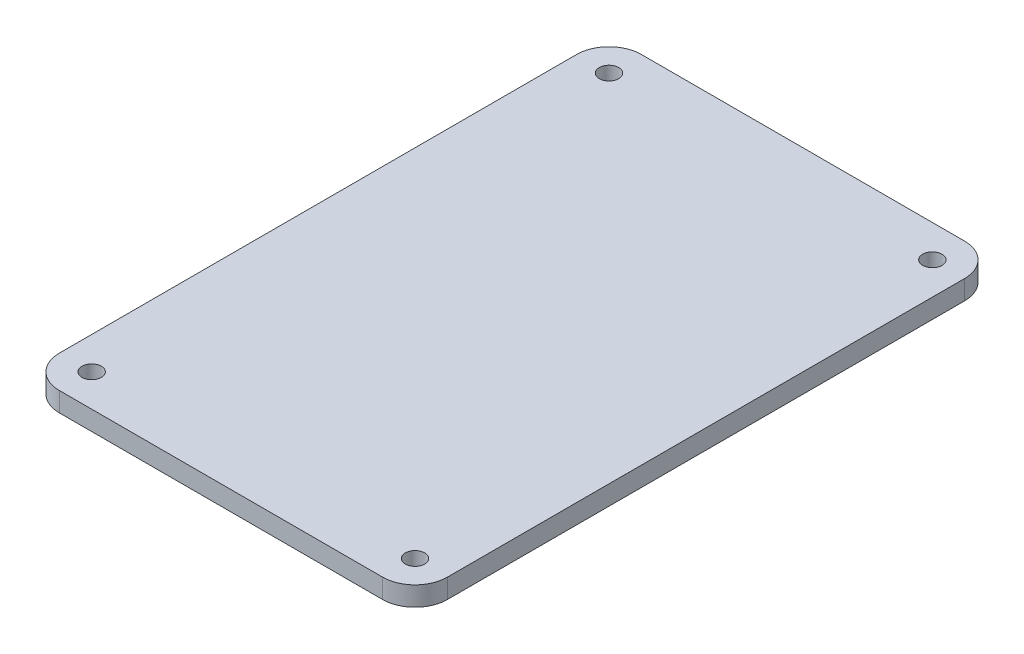
ISO-10303-21;
HEADER;
FILE_DESCRIPTION(('STEP AP214'),'2;1');
FILE_NAME('part.step','',(''),(''),'','','');
FILE_SCHEMA(('AUTOMOTIVE_DESIGN { 1 0 10303 214 1 1 1 1 }'));
ENDSEC;
DATA;
#1=APPLICATION_CONTEXT('core data for automotive mechanical design processes');
#2=APPLICATION_PROTOCOL_DEFINITION('international standard','automotive_design',2000,#1);
#3=PRODUCT_CONTEXT('',#1,'mechanical');
#4=PRODUCT('Part','Part','',(#3));
#5=PRODUCT_RELATED_PRODUCT_CATEGORY('part','',(#4));
#6=PRODUCT_DEFINITION_FORMATION('','',#4);
#7=PRODUCT_DEFINITION_CONTEXT('part definition',#1,'design');
#8=PRODUCT_DEFINITION('design','',#6,#7);
#9=PRODUCT_DEFINITION_SHAPE('','',#8);
#10=(LENGTH_UNIT() NAMED_UNIT(*) SI_UNIT(.MILLI.,.METRE.));
#11=(NAMED_UNIT(*) PLANE_ANGLE_UNIT() SI_UNIT($,.RADIAN.));
#12=(NAMED_UNIT(*) SI_UNIT($,.STERADIAN.) SOLID_ANGLE_UNIT());
#13=UNCERTAINTY_MEASURE_WITH_UNIT(LENGTH_MEASURE(1.E-05),#10,'distance_accuracy_value','');
#14=(GEOMETRIC_REPRESENTATION_CONTEXT(3) GLOBAL_UNCERTAINTY_ASSIGNED_CONTEXT((#13)) GLOBAL_UNIT_ASSIGNED_CONTEXT((#10,
#11,#12)) REPRESENTATION_CONTEXT('',''));
#15=CARTESIAN_POINT('',(0.,0.,0.));
#16=DIRECTION('',(0.,0.,1.));
#17=DIRECTION('',(1.,0.,0.));
#18=AXIS2_PLACEMENT_3D('',#15,#16,#17);
#19=CARTESIAN_POINT('',(25.,3.,40.));
#20=DIRECTION('',(0.,1.,0.));
#21=DIRECTION('',(0.,0.,1.));
#22=AXIS2_PLACEMENT_3D('',#19,#20,#21);
#23=PLANE('',#22);
#24=CARTESIAN_POINT('',(-25.,3.,40.));
#25=DIRECTION('',(0.,1.,0.));
#26=DIRECTION('',(0.,0.,1.));
#27=AXIS2_PLACEMENT_3D('',#24,#25,#26);
#28=CIRCLE('',#27,1.5);
#29=CARTESIAN_POINT('',(-25.,3.,41.5));
#30=VERTEX_POINT('',#29);
#31=EDGE_CURVE('E188',#30,#30,#28,.T.);
#32=ORIENTED_EDGE('',*,*,#31,.F.);
#33=EDGE_LOOP('',(#32));
#34=FACE_BOUND('',#33,.T.);
#35=CARTESIAN_POINT('',(-25.,3.,-40.));
#36=DIRECTION('',(0.,1.,0.));
#37=DIRECTION('',(0.,0.,1.));
#38=AXIS2_PLACEMENT_3D('',#35,#36,#37);
#39=CIRCLE('',#38,1.5);
#40=CARTESIAN_POINT('',(-25.,3.,-38.5));
#41=VERTEX_POINT('',#40);
#42=EDGE_CURVE('E134',#41,#41,#39,.T.);
#43=ORIENTED_EDGE('',*,*,#42,.F.);
#44=EDGE_LOOP('',(#43));
#45=FACE_BOUND('',#44,.T.);
#46=CARTESIAN_POINT('',(25.,3.,40.));
#47=DIRECTION('',(0.,1.,0.));
#48=DIRECTION('',(0.,0.,1.));
#49=AXIS2_PLACEMENT_3D('',#46,#47,#48);
#50=CIRCLE('',#49,5.);
#51=CARTESIAN_POINT('',(25.,3.,45.));
#52=VERTEX_POINT('',#51);
#53=CARTESIAN_POINT('',(30.,3.,40.));
#54=VERTEX_POINT('',#53);
#55=EDGE_CURVE('E145',#52,#54,#50,.T.);
#56=ORIENTED_EDGE('',*,*,#55,.T.);
#57=DIRECTION('',(0.,0.,-1.));
#58=VECTOR('',#57,1.);
#59=CARTESIAN_POINT('',(30.,3.,40.));
#60=LINE('',#59,#58);
#61=CARTESIAN_POINT('',(30.,3.,-40.));
#62=VERTEX_POINT('',#61);
#63=EDGE_CURVE('E93',#54,#62,#60,.T.);
#64=ORIENTED_EDGE('',*,*,#63,.T.);
#65=CARTESIAN_POINT('',(25.,3.,-40.));
#66=DIRECTION('',(0.,1.,0.));
#67=DIRECTION('',(0.,0.,-1.));
#68=AXIS2_PLACEMENT_3D('',#65,#66,#67);
#69=CIRCLE('',#68,5.);
#70=CARTESIAN_POINT('',(25.,3.,-45.));
#71=VERTEX_POINT('',#70);
#72=EDGE_CURVE('E160',#62,#71,#69,.T.);
#73=ORIENTED_EDGE('',*,*,#72,.T.);
#74=DIRECTION('',(-1.,0.,0.));
#75=VECTOR('',#74,1.);
#76=CARTESIAN_POINT('',(-25.,3.,-45.));
#77=LINE('',#76,#75);
#78=CARTESIAN_POINT('',(-25.,3.,-45.));
#79=VERTEX_POINT('',#78);
#80=EDGE_CURVE('E173',#71,#79,#77,.T.);
#81=ORIENTED_EDGE('',*,*,#80,.T.);
#82=CARTESIAN_POINT('',(-25.,3.,-40.));
#83=DIRECTION('',(0.,1.,0.));
#84=DIRECTION('',(0.,0.,-1.));
#85=AXIS2_PLACEMENT_3D('',#82,#83,#84);
#86=CIRCLE('',#85,5.);
#87=CARTESIAN_POINT('',(-30.,3.,-40.));
#88=VERTEX_POINT('',#87);
#89=EDGE_CURVE('E112',#79,#88,#86,.T.);
#90=ORIENTED_EDGE('',*,*,#89,.T.);
#91=DIRECTION('',(0.,0.,1.));
#92=VECTOR('',#91,1.);
#93=CARTESIAN_POINT('',(-30.,3.,40.));
#94=LINE('',#93,#92);
#95=CARTESIAN_POINT('',(-30.,3.,40.));
#96=VERTEX_POINT('',#95);
#97=EDGE_CURVE('E106',#88,#96,#94,.T.);
#98=ORIENTED_EDGE('',*,*,#97,.T.);
#99=CARTESIAN_POINT('',(-25.,3.,40.));
#100=DIRECTION('',(0.,1.,0.));
#101=DIRECTION('',(0.,0.,-1.));
#102=AXIS2_PLACEMENT_3D('',#99,#100,#101);
#103=CIRCLE('',#102,5.);
#104=CARTESIAN_POINT('',(-25.,3.,45.));
#105=VERTEX_POINT('',#104);
#106=EDGE_CURVE('E110',#96,#105,#103,.T.);
#107=ORIENTED_EDGE('',*,*,#106,.T.);
#108=DIRECTION('',(1.,0.,0.));
#109=VECTOR('',#108,1.);
#110=CARTESIAN_POINT('',(-25.,3.,45.));
#111=LINE('',#110,#109);
#112=EDGE_CURVE('E50',#105,#52,#111,.T.);
#113=ORIENTED_EDGE('',*,*,#112,.T.);
#114=EDGE_LOOP('',(#56,#64,#73,#81,#90,#98,#107,#113));
#115=FACE_BOUND('',#114,.T.);
#116=CARTESIAN_POINT('',(25.,3.,-40.));
#117=DIRECTION('',(0.,1.,0.));
#118=DIRECTION('',(0.,0.,1.));
#119=AXIS2_PLACEMENT_3D('',#116,#117,#118);
#120=CIRCLE('',#119,1.5);
#121=CARTESIAN_POINT('',(25.,3.,-38.5));
#122=VERTEX_POINT('',#121);
#123=EDGE_CURVE('E182',#122,#122,#120,.T.);
#124=ORIENTED_EDGE('',*,*,#123,.F.);
#125=EDGE_LOOP('',(#124));
#126=FACE_BOUND('',#125,.T.);
#127=CARTESIAN_POINT('',(25.,3.,40.));
#128=DIRECTION('',(0.,1.,0.));
#129=DIRECTION('',(0.,0.,1.));
#130=AXIS2_PLACEMENT_3D('',#127,#128,#129);
#131=CIRCLE('',#130,1.5);
#132=CARTESIAN_POINT('',(25.,3.,41.5));
#133=VERTEX_POINT('',#132);
#134=EDGE_CURVE('E194',#133,#133,#131,.T.);
#135=ORIENTED_EDGE('',*,*,#134,.F.);
#136=EDGE_LOOP('',(#135));
#137=FACE_BOUND('',#136,.T.);
#138=ADVANCED_FACE('F33',(#34,#45,#115,#126,#137),#23,.T.);
#139=CARTESIAN_POINT('',(25.,0.,40.));
#140=DIRECTION('',(0.,1.,0.));
#141=DIRECTION('',(0.,0.,1.));
#142=AXIS2_PLACEMENT_3D('',#139,#140,#141);
#143=PLANE('',#142);
#144=CARTESIAN_POINT('',(25.,0.,40.));
#145=DIRECTION('',(0.,1.,0.));
#146=DIRECTION('',(0.,0.,1.));
#147=AXIS2_PLACEMENT_3D('',#144,#145,#146);
#148=CIRCLE('',#147,5.);
#149=CARTESIAN_POINT('',(25.,0.,45.));
#150=VERTEX_POINT('',#149);
#151=CARTESIAN_POINT('',(30.,0.,40.));
#152=VERTEX_POINT('',#151);
#153=EDGE_CURVE('E130',#150,#152,#148,.T.);
#154=ORIENTED_EDGE('',*,*,#153,.F.);
#155=DIRECTION('',(1.,0.,0.));
#156=VECTOR('',#155,1.);
#157=CARTESIAN_POINT('',(-25.,0.,45.));
#158=LINE('',#157,#156);
#159=CARTESIAN_POINT('',(-25.,0.,45.));
#160=VERTEX_POINT('',#159);
#161=EDGE_CURVE('E85',#160,#150,#158,.T.);
#162=ORIENTED_EDGE('',*,*,#161,.F.);
#163=CARTESIAN_POINT('',(-25.,0.,40.));
#164=DIRECTION('',(0.,1.,0.));
#165=DIRECTION('',(0.,0.,-1.));
#166=AXIS2_PLACEMENT_3D('',#163,#164,#165);
#167=CIRCLE('',#166,5.);
#168=CARTESIAN_POINT('',(-30.,0.,40.));
#169=VERTEX_POINT('',#168);
#170=EDGE_CURVE('E79',#169,#160,#167,.T.);
#171=ORIENTED_EDGE('',*,*,#170,.F.);
#172=DIRECTION('',(0.,0.,1.));
#173=VECTOR('',#172,1.);
#174=CARTESIAN_POINT('',(-30.,0.,40.));
#175=LINE('',#174,#173);
#176=CARTESIAN_POINT('',(-30.,0.,-40.));
#177=VERTEX_POINT('',#176);
#178=EDGE_CURVE('E120',#177,#169,#175,.T.);
#179=ORIENTED_EDGE('',*,*,#178,.F.);
#180=CARTESIAN_POINT('',(-25.,0.,-40.));
#181=DIRECTION('',(0.,1.,0.));
#182=DIRECTION('',(0.,0.,-1.));
#183=AXIS2_PLACEMENT_3D('',#180,#181,#182);
#184=CIRCLE('',#183,5.);
#185=CARTESIAN_POINT('',(-25.,0.,-45.));
#186=VERTEX_POINT('',#185);
#187=EDGE_CURVE('E140',#186,#177,#184,.T.);
#188=ORIENTED_EDGE('',*,*,#187,.F.);
#189=DIRECTION('',(-1.,0.,0.));
#190=VECTOR('',#189,1.);
#191=CARTESIAN_POINT('',(-25.,0.,-45.));
#192=LINE('',#191,#190);
#193=CARTESIAN_POINT('',(25.,0.,-45.));
#194=VERTEX_POINT('',#193);
#195=EDGE_CURVE('E138',#194,#186,#192,.T.);
#196=ORIENTED_EDGE('',*,*,#195,.F.);
#197=CARTESIAN_POINT('',(25.,0.,-40.));
#198=DIRECTION('',(0.,1.,0.));
#199=DIRECTION('',(0.,0.,-1.));
#200=AXIS2_PLACEMENT_3D('',#197,#198,#199);
#201=CIRCLE('',#200,5.);
#202=CARTESIAN_POINT('',(30.,0.,-40.));
#203=VERTEX_POINT('',#202);
#204=EDGE_CURVE('E136',#203,#194,#201,.T.);
#205=ORIENTED_EDGE('',*,*,#204,.F.);
#206=DIRECTION('',(0.,0.,-1.));
#207=VECTOR('',#206,1.);
#208=CARTESIAN_POINT('',(30.,0.,40.));
#209=LINE('',#208,#207);
#210=EDGE_CURVE('E133',#152,#203,#209,.T.);
#211=ORIENTED_EDGE('',*,*,#210,.F.);
#212=EDGE_LOOP('',(#154,#162,#171,#179,#188,#196,#205,#211));
#213=FACE_BOUND('',#212,.T.);
#214=CARTESIAN_POINT('',(-25.,0.,-40.));
#215=DIRECTION('',(0.,1.,0.));
#216=DIRECTION('',(0.,0.,1.));
#217=AXIS2_PLACEMENT_3D('',#214,#215,#216);
#218=CIRCLE('',#217,1.5);
#219=CARTESIAN_POINT('',(-25.,0.,-38.5));
#220=VERTEX_POINT('',#219);
#221=EDGE_CURVE('E179',#220,#220,#218,.T.);
#222=ORIENTED_EDGE('',*,*,#221,.T.);
#223=EDGE_LOOP('',(#222));
#224=FACE_BOUND('',#223,.T.);
#225=CARTESIAN_POINT('',(25.,0.,-40.));
#226=DIRECTION('',(0.,1.,0.));
#227=DIRECTION('',(0.,0.,1.));
#228=AXIS2_PLACEMENT_3D('',#225,#226,#227);
#229=CIRCLE('',#228,1.5);
#230=CARTESIAN_POINT('',(25.,0.,-38.5));
#231=VERTEX_POINT('',#230);
#232=EDGE_CURVE('E185',#231,#231,#229,.T.);
#233=ORIENTED_EDGE('',*,*,#232,.T.);
#234=EDGE_LOOP('',(#233));
#235=FACE_BOUND('',#234,.T.);
#236=CARTESIAN_POINT('',(-25.,0.,40.));
#237=DIRECTION('',(0.,1.,0.));
#238=DIRECTION('',(0.,0.,1.));
#239=AXIS2_PLACEMENT_3D('',#236,#237,#238);
#240=CIRCLE('',#239,1.5);
#241=CARTESIAN_POINT('',(-25.,0.,41.5));
#242=VERTEX_POINT('',#241);
#243=EDGE_CURVE('E191',#242,#242,#240,.T.);
#244=ORIENTED_EDGE('',*,*,#243,.T.);
#245=EDGE_LOOP('',(#244));
#246=FACE_BOUND('',#245,.T.);
#247=CARTESIAN_POINT('',(25.,0.,40.));
#248=DIRECTION('',(0.,1.,0.));
#249=DIRECTION('',(0.,0.,1.));
#250=AXIS2_PLACEMENT_3D('',#247,#248,#249);
#251=CIRCLE('',#250,1.5);
#252=CARTESIAN_POINT('',(25.,0.,41.5));
#253=VERTEX_POINT('',#252);
#254=EDGE_CURVE('E197',#253,#253,#251,.T.);
#255=ORIENTED_EDGE('',*,*,#254,.T.);
#256=EDGE_LOOP('',(#255));
#257=FACE_BOUND('',#256,.T.);
#258=ADVANCED_FACE('F164',(#213,#224,#235,#246,#257),#143,.F.);
#259=CARTESIAN_POINT('',(25.,3.,40.));
#260=DIRECTION('',(0.,-1.,0.));
#261=DIRECTION('',(0.,0.,-1.));
#262=AXIS2_PLACEMENT_3D('',#259,#260,#261);
#263=CYLINDRICAL_SURFACE('',#262,5.);
#264=ORIENTED_EDGE('',*,*,#153,.T.);
#265=DIRECTION('',(0.,-1.,0.));
#266=VECTOR('',#265,1.);
#267=CARTESIAN_POINT('',(30.,3.,40.));
#268=LINE('',#267,#266);
#269=EDGE_CURVE('E11',#54,#152,#268,.T.);
#270=ORIENTED_EDGE('',*,*,#269,.F.);
#271=ORIENTED_EDGE('',*,*,#55,.F.);
#272=DIRECTION('',(0.,-1.,0.));
#273=VECTOR('',#272,1.);
#274=CARTESIAN_POINT('',(25.,3.,45.));
#275=LINE('',#274,#273);
#276=EDGE_CURVE('E126',#52,#150,#275,.T.);
#277=ORIENTED_EDGE('',*,*,#276,.T.);
#278=EDGE_LOOP('',(#264,#270,#271,#277));
#279=FACE_BOUND('',#278,.T.);
#280=ADVANCED_FACE('F35',(#279),#263,.T.);
#281=CARTESIAN_POINT('',(30.,3.,40.));
#282=DIRECTION('',(-1.,0.,0.));
#283=DIRECTION('',(0.,0.,1.));
#284=AXIS2_PLACEMENT_3D('',#281,#282,#283);
#285=PLANE('',#284);
#286=ORIENTED_EDGE('',*,*,#210,.T.);
#287=DIRECTION('',(0.,-1.,0.));
#288=VECTOR('',#287,1.);
#289=CARTESIAN_POINT('',(30.,3.,-40.));
#290=LINE('',#289,#288);
#291=EDGE_CURVE('E42',#62,#203,#290,.T.);
#292=ORIENTED_EDGE('',*,*,#291,.F.);
#293=ORIENTED_EDGE('',*,*,#63,.F.);
#294=ORIENTED_EDGE('',*,*,#269,.T.);
#295=EDGE_LOOP('',(#286,#292,#293,#294));
#296=FACE_BOUND('',#295,.T.);
#297=ADVANCED_FACE('F231',(#296),#285,.F.);
#298=CARTESIAN_POINT('',(25.,3.,-40.));
#299=DIRECTION('',(0.,-1.,0.));
#300=DIRECTION('',(0.,0.,-1.));
#301=AXIS2_PLACEMENT_3D('',#298,#299,#300);
#302=CYLINDRICAL_SURFACE('',#301,5.);
#303=ORIENTED_EDGE('',*,*,#204,.T.);
#304=DIRECTION('',(0.,-1.,0.));
#305=VECTOR('',#304,1.);
#306=CARTESIAN_POINT('',(25.,3.,-45.));
#307=LINE('',#306,#305);
#308=EDGE_CURVE('E152',#71,#194,#307,.T.);
#309=ORIENTED_EDGE('',*,*,#308,.F.);
#310=ORIENTED_EDGE('',*,*,#72,.F.);
#311=ORIENTED_EDGE('',*,*,#291,.T.);
#312=EDGE_LOOP('',(#303,#309,#310,#311));
#313=FACE_BOUND('',#312,.T.);
#314=ADVANCED_FACE('F158',(#313),#302,.T.);
#315=CARTESIAN_POINT('',(-25.,3.,-45.));
#316=DIRECTION('',(0.,0.,1.));
#317=DIRECTION('',(1.,0.,0.));
#318=AXIS2_PLACEMENT_3D('',#315,#316,#317);
#319=PLANE('',#318);
#320=ORIENTED_EDGE('',*,*,#195,.T.);
#321=DIRECTION('',(0.,-1.,0.));
#322=VECTOR('',#321,1.);
#323=CARTESIAN_POINT('',(-25.,3.,-45.));
#324=LINE('',#323,#322);
#325=EDGE_CURVE('E149',#79,#186,#324,.T.);
#326=ORIENTED_EDGE('',*,*,#325,.F.);
#327=ORIENTED_EDGE('',*,*,#80,.F.);
#328=ORIENTED_EDGE('',*,*,#308,.T.);
#329=EDGE_LOOP('',(#320,#326,#327,#328));
#330=FACE_BOUND('',#329,.T.);
#331=ADVANCED_FACE('F169',(#330),#319,.F.);
#332=CARTESIAN_POINT('',(-25.,3.,-40.));
#333=DIRECTION('',(0.,-1.,0.));
#334=DIRECTION('',(0.,0.,-1.));
#335=AXIS2_PLACEMENT_3D('',#332,#333,#334);
#336=CYLINDRICAL_SURFACE('',#335,5.);
#337=ORIENTED_EDGE('',*,*,#187,.T.);
#338=DIRECTION('',(0.,-1.,0.));
#339=VECTOR('',#338,1.);
#340=CARTESIAN_POINT('',(-30.,3.,-40.));
#341=LINE('',#340,#339);
#342=EDGE_CURVE('E121',#88,#177,#341,.T.);
#343=ORIENTED_EDGE('',*,*,#342,.F.);
#344=ORIENTED_EDGE('',*,*,#89,.F.);
#345=ORIENTED_EDGE('',*,*,#325,.T.);
#346=EDGE_LOOP('',(#337,#343,#344,#345));
#347=FACE_BOUND('',#346,.T.);
#348=ADVANCED_FACE('F172',(#347),#336,.T.);
#349=CARTESIAN_POINT('',(-30.,3.,40.));
#350=DIRECTION('',(1.,0.,0.));
#351=DIRECTION('',(0.,0.,-1.));
#352=AXIS2_PLACEMENT_3D('',#349,#350,#351);
#353=PLANE('',#352);
#354=ORIENTED_EDGE('',*,*,#178,.T.);
#355=DIRECTION('',(0.,-1.,0.));
#356=VECTOR('',#355,1.);
#357=CARTESIAN_POINT('',(-30.,3.,40.));
#358=LINE('',#357,#356);
#359=EDGE_CURVE('E117',#96,#169,#358,.T.);
#360=ORIENTED_EDGE('',*,*,#359,.F.);
#361=ORIENTED_EDGE('',*,*,#97,.F.);
#362=ORIENTED_EDGE('',*,*,#342,.T.);
#363=EDGE_LOOP('',(#354,#360,#361,#362));
#364=FACE_BOUND('',#363,.T.);
#365=ADVANCED_FACE('F118',(#364),#353,.F.);
#366=CARTESIAN_POINT('',(-25.,3.,40.));
#367=DIRECTION('',(0.,-1.,0.));
#368=DIRECTION('',(0.,0.,-1.));
#369=AXIS2_PLACEMENT_3D('',#366,#367,#368);
#370=CYLINDRICAL_SURFACE('',#369,5.);
#371=ORIENTED_EDGE('',*,*,#170,.T.);
#372=DIRECTION('',(0.,-1.,0.));
#373=VECTOR('',#372,1.);
#374=CARTESIAN_POINT('',(-25.,3.,45.));
#375=LINE('',#374,#373);
#376=EDGE_CURVE('E122',#105,#160,#375,.T.);
#377=ORIENTED_EDGE('',*,*,#376,.F.);
#378=ORIENTED_EDGE('',*,*,#106,.F.);
#379=ORIENTED_EDGE('',*,*,#359,.T.);
#380=EDGE_LOOP('',(#371,#377,#378,#379));
#381=FACE_BOUND('',#380,.T.);
#382=ADVANCED_FACE('F124',(#381),#370,.T.);
#383=CARTESIAN_POINT('',(-25.,3.,45.));
#384=DIRECTION('',(0.,0.,-1.));
#385=DIRECTION('',(-1.,0.,0.));
#386=AXIS2_PLACEMENT_3D('',#383,#384,#385);
#387=PLANE('',#386);
#388=ORIENTED_EDGE('',*,*,#161,.T.);
#389=ORIENTED_EDGE('',*,*,#276,.F.);
#390=ORIENTED_EDGE('',*,*,#112,.F.);
#391=ORIENTED_EDGE('',*,*,#376,.T.);
#392=EDGE_LOOP('',(#388,#389,#390,#391));
#393=FACE_BOUND('',#392,.T.);
#394=ADVANCED_FACE('F219',(#393),#387,.F.);
#395=CARTESIAN_POINT('',(-25.,3.,-40.));
#396=DIRECTION('',(0.,-1.,0.));
#397=DIRECTION('',(0.,0.,-1.));
#398=AXIS2_PLACEMENT_3D('',#395,#396,#397);
#399=CYLINDRICAL_SURFACE('',#398,1.5);
#400=ORIENTED_EDGE('',*,*,#42,.T.);
#401=EDGE_LOOP('',(#400));
#402=FACE_BOUND('',#401,.T.);
#403=ORIENTED_EDGE('',*,*,#221,.F.);
#404=EDGE_LOOP('',(#403));
#405=FACE_BOUND('',#404,.T.);
#406=ADVANCED_FACE('F216',(#402,#405),#399,.F.);
#407=CARTESIAN_POINT('',(25.,3.,-40.));
#408=DIRECTION('',(0.,-1.,0.));
#409=DIRECTION('',(0.,0.,-1.));
#410=AXIS2_PLACEMENT_3D('',#407,#408,#409);
#411=CYLINDRICAL_SURFACE('',#410,1.5);
#412=ORIENTED_EDGE('',*,*,#123,.T.);
#413=EDGE_LOOP('',(#412));
#414=FACE_BOUND('',#413,.T.);
#415=ORIENTED_EDGE('',*,*,#232,.F.);
#416=EDGE_LOOP('',(#415));
#417=FACE_BOUND('',#416,.T.);
#418=ADVANCED_FACE('F295',(#414,#417),#411,.F.);
#419=CARTESIAN_POINT('',(-25.,3.,40.));
#420=DIRECTION('',(0.,-1.,0.));
#421=DIRECTION('',(0.,0.,-1.));
#422=AXIS2_PLACEMENT_3D('',#419,#420,#421);
#423=CYLINDRICAL_SURFACE('',#422,1.5);
#424=ORIENTED_EDGE('',*,*,#31,.T.);
#425=EDGE_LOOP('',(#424));
#426=FACE_BOUND('',#425,.T.);
#427=ORIENTED_EDGE('',*,*,#243,.F.);
#428=EDGE_LOOP('',(#427));
#429=FACE_BOUND('',#428,.T.);
#430=ADVANCED_FACE('F303',(#426,#429),#423,.F.);
#431=CARTESIAN_POINT('',(25.,3.,40.));
#432=DIRECTION('',(0.,-1.,0.));
#433=DIRECTION('',(0.,0.,-1.));
#434=AXIS2_PLACEMENT_3D('',#431,#432,#433);
#435=CYLINDRICAL_SURFACE('',#434,1.5);
#436=ORIENTED_EDGE('',*,*,#134,.T.);
#437=EDGE_LOOP('',(#436));
#438=FACE_BOUND('',#437,.T.);
#439=ORIENTED_EDGE('',*,*,#254,.F.);
#440=EDGE_LOOP('',(#439));
#441=FACE_BOUND('',#440,.T.);
#442=ADVANCED_FACE('F203',(#438,#441),#435,.F.);
#443=CLOSED_SHELL('',(#138,#258,#280,#297,#314,#331,#348,#365,#382,#394,#406,#418,#430,#442));
#444=MANIFOLD_SOLID_BREP('B2',#443);
#445=ADVANCED_BREP_SHAPE_REPRESENTATION('',(#18,#444),#14);
#446=SHAPE_DEFINITION_REPRESENTATION(#9,#445);
ENDSEC;
END-ISO-10303-21;
